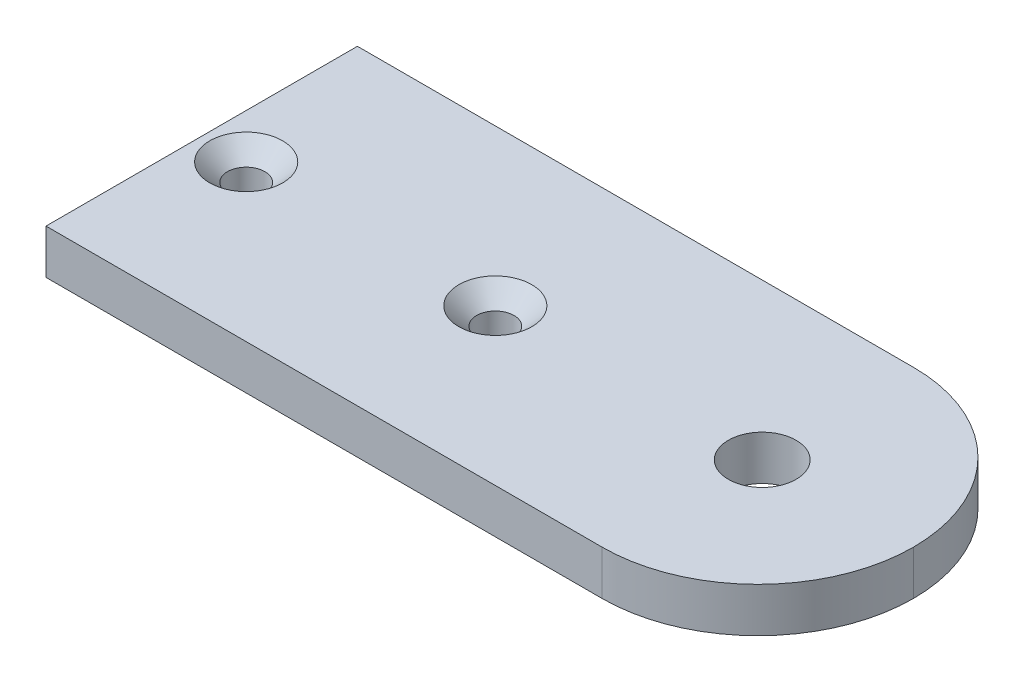
ISO-10303-21;
HEADER;
FILE_DESCRIPTION(('STEP AP214'),'2;1');
FILE_NAME('part.step','',(''),(''),'','','');
FILE_SCHEMA(('AUTOMOTIVE_DESIGN { 1 0 10303 214 1 1 1 1 }'));
ENDSEC;
DATA;
#1=APPLICATION_CONTEXT('core data for automotive mechanical design processes');
#2=APPLICATION_PROTOCOL_DEFINITION('international standard','automotive_design',2000,#1);
#3=PRODUCT_CONTEXT('',#1,'mechanical');
#4=PRODUCT('Part','Part','',(#3));
#5=PRODUCT_RELATED_PRODUCT_CATEGORY('part','',(#4));
#6=PRODUCT_DEFINITION_FORMATION('','',#4);
#7=PRODUCT_DEFINITION_CONTEXT('part definition',#1,'design');
#8=PRODUCT_DEFINITION('design','',#6,#7);
#9=PRODUCT_DEFINITION_SHAPE('','',#8);
#10=(LENGTH_UNIT() NAMED_UNIT(*) SI_UNIT(.MILLI.,.METRE.));
#11=(NAMED_UNIT(*) PLANE_ANGLE_UNIT() SI_UNIT($,.RADIAN.));
#12=(NAMED_UNIT(*) SI_UNIT($,.STERADIAN.) SOLID_ANGLE_UNIT());
#13=UNCERTAINTY_MEASURE_WITH_UNIT(LENGTH_MEASURE(1.E-05),#10,'distance_accuracy_value','');
#14=(GEOMETRIC_REPRESENTATION_CONTEXT(3) GLOBAL_UNCERTAINTY_ASSIGNED_CONTEXT((#13)) GLOBAL_UNIT_ASSIGNED_CONTEXT((#10,
#11,#12)) REPRESENTATION_CONTEXT('',''));
#15=CARTESIAN_POINT('',(0.,0.,0.));
#16=DIRECTION('',(0.,0.,1.));
#17=DIRECTION('',(1.,0.,0.));
#18=AXIS2_PLACEMENT_3D('',#15,#16,#17);
#19=CARTESIAN_POINT('',(0.,5.,0.));
#20=DIRECTION('',(1.,0.,0.));
#21=DIRECTION('',(0.,0.,-1.));
#22=AXIS2_PLACEMENT_3D('',#19,#20,#21);
#23=PLANE('',#22);
#24=DIRECTION('',(0.,0.,1.));
#25=VECTOR('',#24,1.);
#26=CARTESIAN_POINT('',(0.,0.,0.));
#27=LINE('',#26,#25);
#28=CARTESIAN_POINT('',(0.,0.,0.));
#29=VERTEX_POINT('',#28);
#30=CARTESIAN_POINT('',(0.,0.,35.));
#31=VERTEX_POINT('',#30);
#32=EDGE_CURVE('E106',#29,#31,#27,.T.);
#33=ORIENTED_EDGE('',*,*,#32,.T.);
#34=DIRECTION('',(0.,-1.,0.));
#35=VECTOR('',#34,1.);
#36=CARTESIAN_POINT('',(0.,5.,35.));
#37=LINE('',#36,#35);
#38=CARTESIAN_POINT('',(0.,5.,35.));
#39=VERTEX_POINT('',#38);
#40=EDGE_CURVE('E89',#39,#31,#37,.T.);
#41=ORIENTED_EDGE('',*,*,#40,.F.);
#42=DIRECTION('',(0.,0.,1.));
#43=VECTOR('',#42,1.);
#44=CARTESIAN_POINT('',(0.,5.,0.));
#45=LINE('',#44,#43);
#46=CARTESIAN_POINT('',(0.,5.,0.));
#47=VERTEX_POINT('',#46);
#48=EDGE_CURVE('E95',#47,#39,#45,.T.);
#49=ORIENTED_EDGE('',*,*,#48,.F.);
#50=DIRECTION('',(0.,-1.,0.));
#51=VECTOR('',#50,1.);
#52=CARTESIAN_POINT('',(0.,5.,0.));
#53=LINE('',#52,#51);
#54=EDGE_CURVE('E109',#47,#29,#53,.T.);
#55=ORIENTED_EDGE('',*,*,#54,.T.);
#56=EDGE_LOOP('',(#33,#41,#49,#55));
#57=FACE_BOUND('',#56,.T.);
#58=ADVANCED_FACE('F39',(#57),#23,.F.);
#59=CARTESIAN_POINT('',(0.,5.,35.));
#60=DIRECTION('',(0.,0.,-1.));
#61=DIRECTION('',(-1.,0.,0.));
#62=AXIS2_PLACEMENT_3D('',#59,#60,#61);
#63=PLANE('',#62);
#64=DIRECTION('',(1.,0.,0.));
#65=VECTOR('',#64,1.);
#66=CARTESIAN_POINT('',(0.,0.,35.));
#67=LINE('',#66,#65);
#68=CARTESIAN_POINT('',(62.5,0.,35.));
#69=VERTEX_POINT('',#68);
#70=EDGE_CURVE('E128',#31,#69,#67,.T.);
#71=ORIENTED_EDGE('',*,*,#70,.T.);
#72=DIRECTION('',(0.,-1.,0.));
#73=VECTOR('',#72,1.);
#74=CARTESIAN_POINT('',(62.5,5.,35.));
#75=LINE('',#74,#73);
#76=CARTESIAN_POINT('',(62.5,5.,35.));
#77=VERTEX_POINT('',#76);
#78=EDGE_CURVE('E92',#69,#77,#75,.F.);
#79=ORIENTED_EDGE('',*,*,#78,.T.);
#80=DIRECTION('',(1.,0.,0.));
#81=VECTOR('',#80,1.);
#82=CARTESIAN_POINT('',(0.,5.,35.));
#83=LINE('',#82,#81);
#84=EDGE_CURVE('E84',#39,#77,#83,.T.);
#85=ORIENTED_EDGE('',*,*,#84,.F.);
#86=ORIENTED_EDGE('',*,*,#40,.T.);
#87=EDGE_LOOP('',(#71,#79,#85,#86));
#88=FACE_BOUND('',#87,.T.);
#89=ADVANCED_FACE('F87',(#88),#63,.F.);
#90=CARTESIAN_POINT('',(0.,5.,0.));
#91=DIRECTION('',(0.,0.,1.));
#92=DIRECTION('',(1.,0.,0.));
#93=AXIS2_PLACEMENT_3D('',#90,#91,#92);
#94=PLANE('',#93);
#95=DIRECTION('',(-1.,0.,0.));
#96=VECTOR('',#95,1.);
#97=CARTESIAN_POINT('',(0.,5.,0.));
#98=LINE('',#97,#96);
#99=CARTESIAN_POINT('',(62.5,5.,0.));
#100=VERTEX_POINT('',#99);
#101=EDGE_CURVE('E94',#100,#47,#98,.T.);
#102=ORIENTED_EDGE('',*,*,#101,.F.);
#103=DIRECTION('',(0.,-1.,0.));
#104=VECTOR('',#103,1.);
#105=CARTESIAN_POINT('',(62.5,5.,0.));
#106=LINE('',#105,#104);
#107=CARTESIAN_POINT('',(62.5,0.,0.));
#108=VERTEX_POINT('',#107);
#109=EDGE_CURVE('E11',#100,#108,#106,.T.);
#110=ORIENTED_EDGE('',*,*,#109,.T.);
#111=DIRECTION('',(-1.,0.,0.));
#112=VECTOR('',#111,1.);
#113=CARTESIAN_POINT('',(0.,0.,0.));
#114=LINE('',#113,#112);
#115=EDGE_CURVE('E103',#108,#29,#114,.T.);
#116=ORIENTED_EDGE('',*,*,#115,.T.);
#117=ORIENTED_EDGE('',*,*,#54,.F.);
#118=EDGE_LOOP('',(#102,#110,#116,#117));
#119=FACE_BOUND('',#118,.T.);
#120=ADVANCED_FACE('F179',(#119),#94,.F.);
#121=CARTESIAN_POINT('',(0.,5.,0.));
#122=DIRECTION('',(0.,1.,0.));
#123=DIRECTION('',(0.,0.,1.));
#124=AXIS2_PLACEMENT_3D('',#121,#122,#123);
#125=PLANE('',#124);
#126=CARTESIAN_POINT('',(63.,5.,17.5));
#127=DIRECTION('',(0.,-1.,0.));
#128=DIRECTION('',(0.,0.,-1.));
#129=AXIS2_PLACEMENT_3D('',#126,#127,#128);
#130=CIRCLE('',#129,3.81);
#131=CARTESIAN_POINT('',(63.,5.,13.69));
#132=VERTEX_POINT('',#131);
#133=EDGE_CURVE('E142',#132,#132,#130,.T.);
#134=ORIENTED_EDGE('',*,*,#133,.T.);
#135=EDGE_LOOP('',(#134));
#136=FACE_BOUND('',#135,.T.);
#137=CARTESIAN_POINT('',(5.,5.,17.5));
#138=DIRECTION('',(0.,1.,0.));
#139=DIRECTION('',(0.,0.,1.));
#140=AXIS2_PLACEMENT_3D('',#137,#138,#139);
#141=CIRCLE('',#140,4.1);
#142=CARTESIAN_POINT('',(5.,5.,21.6));
#143=VERTEX_POINT('',#142);
#144=EDGE_CURVE('E148',#143,#143,#141,.T.);
#145=ORIENTED_EDGE('',*,*,#144,.F.);
#146=EDGE_LOOP('',(#145));
#147=FACE_BOUND('',#146,.T.);
#148=CARTESIAN_POINT('',(33.,5.,17.5));
#149=DIRECTION('',(0.,1.,0.));
#150=DIRECTION('',(0.,0.,1.));
#151=AXIS2_PLACEMENT_3D('',#148,#149,#150);
#152=CIRCLE('',#151,4.1);
#153=CARTESIAN_POINT('',(33.,5.,21.6));
#154=VERTEX_POINT('',#153);
#155=EDGE_CURVE('E162',#154,#154,#152,.T.);
#156=ORIENTED_EDGE('',*,*,#155,.F.);
#157=EDGE_LOOP('',(#156));
#158=FACE_BOUND('',#157,.T.);
#159=ORIENTED_EDGE('',*,*,#84,.T.);
#160=CARTESIAN_POINT('',(62.5,5.,17.5));
#161=DIRECTION('',(0.,1.,0.));
#162=DIRECTION('',(0.,0.,1.));
#163=AXIS2_PLACEMENT_3D('',#160,#161,#162);
#164=CIRCLE('',#163,17.5);
#165=CARTESIAN_POINT('',(80.,5.,17.5));
#166=VERTEX_POINT('',#165);
#167=EDGE_CURVE('E49',#77,#166,#164,.T.);
#168=ORIENTED_EDGE('',*,*,#167,.T.);
#169=CARTESIAN_POINT('',(62.5,5.,17.5));
#170=DIRECTION('',(0.,1.,0.));
#171=DIRECTION('',(0.,0.,1.));
#172=AXIS2_PLACEMENT_3D('',#169,#170,#171);
#173=CIRCLE('',#172,17.5);
#174=EDGE_CURVE('E56',#166,#100,#173,.T.);
#175=ORIENTED_EDGE('',*,*,#174,.T.);
#176=ORIENTED_EDGE('',*,*,#101,.T.);
#177=ORIENTED_EDGE('',*,*,#48,.T.);
#178=EDGE_LOOP('',(#159,#168,#175,#176,#177));
#179=FACE_BOUND('',#178,.T.);
#180=ADVANCED_FACE('F98',(#136,#147,#158,#179),#125,.T.);
#181=CARTESIAN_POINT('',(0.,0.,0.));
#182=DIRECTION('',(0.,1.,0.));
#183=DIRECTION('',(0.,0.,1.));
#184=AXIS2_PLACEMENT_3D('',#181,#182,#183);
#185=PLANE('',#184);
#186=CARTESIAN_POINT('',(63.,0.,17.5));
#187=DIRECTION('',(0.,-1.,0.));
#188=DIRECTION('',(0.,0.,-1.));
#189=AXIS2_PLACEMENT_3D('',#186,#187,#188);
#190=CIRCLE('',#189,3.81);
#191=CARTESIAN_POINT('',(63.,0.,13.69));
#192=VERTEX_POINT('',#191);
#193=EDGE_CURVE('E139',#192,#192,#190,.T.);
#194=ORIENTED_EDGE('',*,*,#193,.F.);
#195=EDGE_LOOP('',(#194));
#196=FACE_BOUND('',#195,.T.);
#197=CARTESIAN_POINT('',(5.,0.,17.5));
#198=DIRECTION('',(0.,1.,0.));
#199=DIRECTION('',(0.,0.,1.));
#200=AXIS2_PLACEMENT_3D('',#197,#198,#199);
#201=CIRCLE('',#200,2.1);
#202=CARTESIAN_POINT('',(5.,0.,19.6));
#203=VERTEX_POINT('',#202);
#204=EDGE_CURVE('E158',#203,#203,#201,.T.);
#205=ORIENTED_EDGE('',*,*,#204,.T.);
#206=EDGE_LOOP('',(#205));
#207=FACE_BOUND('',#206,.T.);
#208=CARTESIAN_POINT('',(33.,0.,17.5));
#209=DIRECTION('',(0.,1.,0.));
#210=DIRECTION('',(0.,0.,1.));
#211=AXIS2_PLACEMENT_3D('',#208,#209,#210);
#212=CIRCLE('',#211,2.1);
#213=CARTESIAN_POINT('',(33.,0.,19.6));
#214=VERTEX_POINT('',#213);
#215=EDGE_CURVE('E170',#214,#214,#212,.T.);
#216=ORIENTED_EDGE('',*,*,#215,.T.);
#217=EDGE_LOOP('',(#216));
#218=FACE_BOUND('',#217,.T.);
#219=CARTESIAN_POINT('',(62.5,0.,17.5));
#220=DIRECTION('',(0.,1.,0.));
#221=DIRECTION('',(0.,0.,1.));
#222=AXIS2_PLACEMENT_3D('',#219,#220,#221);
#223=CIRCLE('',#222,17.5);
#224=CARTESIAN_POINT('',(80.,0.,17.5));
#225=VERTEX_POINT('',#224);
#226=EDGE_CURVE('E108',#108,#225,#223,.F.);
#227=ORIENTED_EDGE('',*,*,#226,.T.);
#228=CARTESIAN_POINT('',(62.5,0.,17.5));
#229=DIRECTION('',(0.,1.,0.));
#230=DIRECTION('',(0.,0.,1.));
#231=AXIS2_PLACEMENT_3D('',#228,#229,#230);
#232=CIRCLE('',#231,17.5);
#233=EDGE_CURVE('E113',#225,#69,#232,.F.);
#234=ORIENTED_EDGE('',*,*,#233,.T.);
#235=ORIENTED_EDGE('',*,*,#70,.F.);
#236=ORIENTED_EDGE('',*,*,#32,.F.);
#237=ORIENTED_EDGE('',*,*,#115,.F.);
#238=EDGE_LOOP('',(#227,#234,#235,#236,#237));
#239=FACE_BOUND('',#238,.T.);
#240=ADVANCED_FACE('F127',(#196,#207,#218,#239),#185,.F.);
#241=CARTESIAN_POINT('',(33.,5.,17.5));
#242=DIRECTION('',(0.,1.,0.));
#243=DIRECTION('',(0.,0.,1.));
#244=AXIS2_PLACEMENT_3D('',#241,#242,#243);
#245=CYLINDRICAL_SURFACE('',#244,2.1);
#246=ORIENTED_EDGE('',*,*,#215,.F.);
#247=EDGE_LOOP('',(#246));
#248=FACE_BOUND('',#247,.T.);
#249=CARTESIAN_POINT('',(33.,3.,17.5));
#250=DIRECTION('',(0.,1.,0.));
#251=DIRECTION('',(0.,0.,1.));
#252=AXIS2_PLACEMENT_3D('',#249,#250,#251);
#253=CIRCLE('',#252,2.1);
#254=CARTESIAN_POINT('',(33.,3.,19.6));
#255=VERTEX_POINT('',#254);
#256=EDGE_CURVE('E166',#255,#255,#253,.T.);
#257=ORIENTED_EDGE('',*,*,#256,.T.);
#258=EDGE_LOOP('',(#257));
#259=FACE_BOUND('',#258,.T.);
#260=ADVANCED_FACE('F201',(#248,#259),#245,.F.);
#261=CARTESIAN_POINT('',(33.,5.,17.5));
#262=DIRECTION('',(0.,1.,0.));
#263=DIRECTION('',(0.,0.,1.));
#264=AXIS2_PLACEMENT_3D('',#261,#262,#263);
#265=CONICAL_SURFACE('',#264,4.1,0.785398163397449);
#266=ORIENTED_EDGE('',*,*,#256,.F.);
#267=EDGE_LOOP('',(#266));
#268=FACE_BOUND('',#267,.T.);
#269=ORIENTED_EDGE('',*,*,#155,.T.);
#270=EDGE_LOOP('',(#269));
#271=FACE_BOUND('',#270,.T.);
#272=ADVANCED_FACE('F208',(#268,#271),#265,.F.);
#273=CARTESIAN_POINT('',(5.,5.,17.5));
#274=DIRECTION('',(0.,1.,0.));
#275=DIRECTION('',(0.,0.,1.));
#276=AXIS2_PLACEMENT_3D('',#273,#274,#275);
#277=CYLINDRICAL_SURFACE('',#276,2.1);
#278=ORIENTED_EDGE('',*,*,#204,.F.);
#279=EDGE_LOOP('',(#278));
#280=FACE_BOUND('',#279,.T.);
#281=CARTESIAN_POINT('',(5.,3.,17.5));
#282=DIRECTION('',(0.,1.,0.));
#283=DIRECTION('',(0.,0.,1.));
#284=AXIS2_PLACEMENT_3D('',#281,#282,#283);
#285=CIRCLE('',#284,2.1);
#286=CARTESIAN_POINT('',(5.,3.,19.6));
#287=VERTEX_POINT('',#286);
#288=EDGE_CURVE('E154',#287,#287,#285,.T.);
#289=ORIENTED_EDGE('',*,*,#288,.T.);
#290=EDGE_LOOP('',(#289));
#291=FACE_BOUND('',#290,.T.);
#292=ADVANCED_FACE('F212',(#280,#291),#277,.F.);
#293=CARTESIAN_POINT('',(5.,5.,17.5));
#294=DIRECTION('',(0.,1.,0.));
#295=DIRECTION('',(0.,0.,1.));
#296=AXIS2_PLACEMENT_3D('',#293,#294,#295);
#297=CONICAL_SURFACE('',#296,4.1,0.785398163397448);
#298=ORIENTED_EDGE('',*,*,#288,.F.);
#299=EDGE_LOOP('',(#298));
#300=FACE_BOUND('',#299,.T.);
#301=ORIENTED_EDGE('',*,*,#144,.T.);
#302=EDGE_LOOP('',(#301));
#303=FACE_BOUND('',#302,.T.);
#304=ADVANCED_FACE('F187',(#300,#303),#297,.F.);
#305=CARTESIAN_POINT('',(63.,5.,17.5));
#306=DIRECTION('',(0.,-1.,0.));
#307=DIRECTION('',(0.,0.,-1.));
#308=AXIS2_PLACEMENT_3D('',#305,#306,#307);
#309=CYLINDRICAL_SURFACE('',#308,3.81);
#310=ORIENTED_EDGE('',*,*,#133,.F.);
#311=EDGE_LOOP('',(#310));
#312=FACE_BOUND('',#311,.T.);
#313=ORIENTED_EDGE('',*,*,#193,.T.);
#314=EDGE_LOOP('',(#313));
#315=FACE_BOUND('',#314,.T.);
#316=ADVANCED_FACE('F182',(#312,#315),#309,.F.);
#317=CARTESIAN_POINT('',(62.5,5.,17.5));
#318=DIRECTION('',(0.,-1.,0.));
#319=DIRECTION('',(0.,0.,-1.));
#320=AXIS2_PLACEMENT_3D('',#317,#318,#319);
#321=CYLINDRICAL_SURFACE('',#320,17.5);
#322=ORIENTED_EDGE('',*,*,#109,.F.);
#323=ORIENTED_EDGE('',*,*,#174,.F.);
#324=DIRECTION('',(0.,-1.,0.));
#325=VECTOR('',#324,1.);
#326=CARTESIAN_POINT('',(80.,5.,17.5));
#327=LINE('',#326,#325);
#328=EDGE_CURVE('E43',#225,#166,#327,.F.);
#329=ORIENTED_EDGE('',*,*,#328,.F.);
#330=ORIENTED_EDGE('',*,*,#226,.F.);
#331=EDGE_LOOP('',(#322,#323,#329,#330));
#332=FACE_BOUND('',#331,.T.);
#333=ADVANCED_FACE('F41',(#332),#321,.T.);
#334=CARTESIAN_POINT('',(62.5,5.,17.5));
#335=DIRECTION('',(0.,-1.,0.));
#336=DIRECTION('',(0.,0.,-1.));
#337=AXIS2_PLACEMENT_3D('',#334,#335,#336);
#338=CYLINDRICAL_SURFACE('',#337,17.5);
#339=ORIENTED_EDGE('',*,*,#167,.F.);
#340=ORIENTED_EDGE('',*,*,#78,.F.);
#341=ORIENTED_EDGE('',*,*,#233,.F.);
#342=ORIENTED_EDGE('',*,*,#328,.T.);
#343=EDGE_LOOP('',(#339,#340,#341,#342));
#344=FACE_BOUND('',#343,.T.);
#345=ADVANCED_FACE('F136',(#344),#338,.T.);
#346=CLOSED_SHELL('',(#58,#89,#120,#180,#240,#260,#272,#292,#304,#316,#333,#345));
#347=MANIFOLD_SOLID_BREP('B2',#346);
#348=ADVANCED_BREP_SHAPE_REPRESENTATION('',(#18,#347),#14);
#349=SHAPE_DEFINITION_REPRESENTATION(#9,#348);
ENDSEC;
END-ISO-10303-21;
